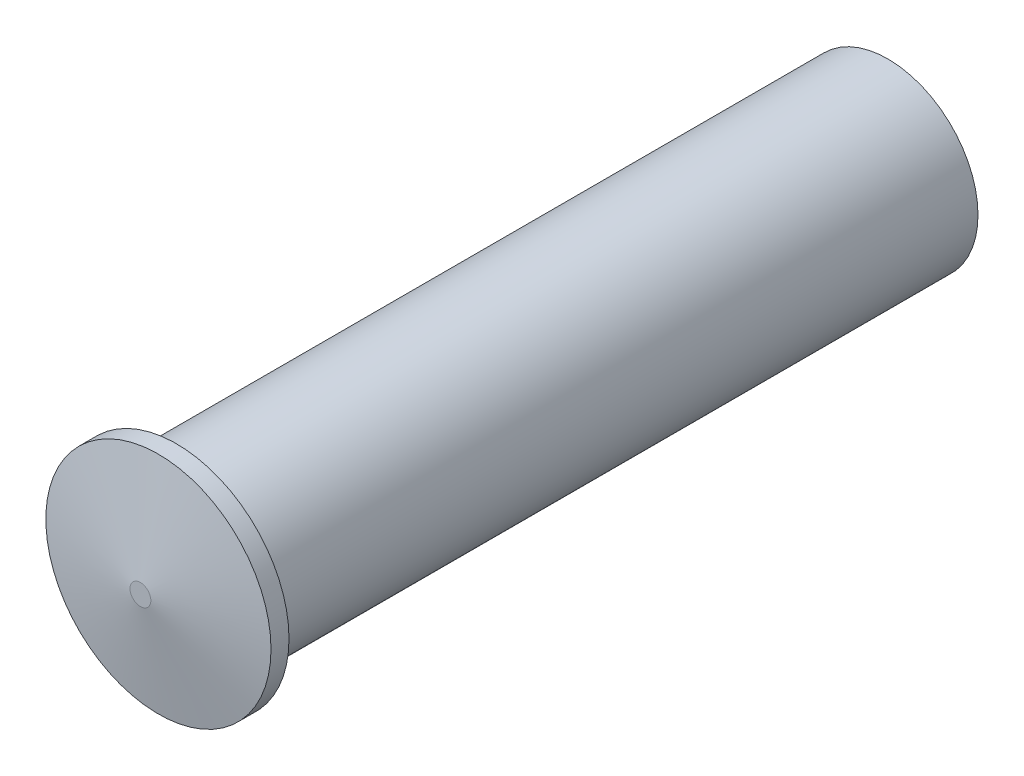
ISO-10303-21;
HEADER;
FILE_DESCRIPTION(('STEP AP214'),'2;1');
FILE_NAME('part.step','',(''),(''),'','','');
FILE_SCHEMA(('AUTOMOTIVE_DESIGN { 1 0 10303 214 1 1 1 1 }'));
ENDSEC;
DATA;
#1=APPLICATION_CONTEXT('core data for automotive mechanical design processes');
#2=APPLICATION_PROTOCOL_DEFINITION('international standard','automotive_design',2000,#1);
#3=PRODUCT_CONTEXT('',#1,'mechanical');
#4=PRODUCT('Part','Part','',(#3));
#5=PRODUCT_RELATED_PRODUCT_CATEGORY('part','',(#4));
#6=PRODUCT_DEFINITION_FORMATION('','',#4);
#7=PRODUCT_DEFINITION_CONTEXT('part definition',#1,'design');
#8=PRODUCT_DEFINITION('design','',#6,#7);
#9=PRODUCT_DEFINITION_SHAPE('','',#8);
#10=(LENGTH_UNIT() NAMED_UNIT(*) SI_UNIT(.MILLI.,.METRE.));
#11=(NAMED_UNIT(*) PLANE_ANGLE_UNIT() SI_UNIT($,.RADIAN.));
#12=(NAMED_UNIT(*) SI_UNIT($,.STERADIAN.) SOLID_ANGLE_UNIT());
#13=UNCERTAINTY_MEASURE_WITH_UNIT(LENGTH_MEASURE(1.E-05),#10,'distance_accuracy_value','');
#14=(GEOMETRIC_REPRESENTATION_CONTEXT(3) GLOBAL_UNCERTAINTY_ASSIGNED_CONTEXT((#13)) GLOBAL_UNIT_ASSIGNED_CONTEXT((#10,
#11,#12)) REPRESENTATION_CONTEXT('',''));
#15=CARTESIAN_POINT('',(0.,0.,0.));
#16=DIRECTION('',(0.,0.,1.));
#17=DIRECTION('',(1.,0.,0.));
#18=AXIS2_PLACEMENT_3D('',#15,#16,#17);
#19=CARTESIAN_POINT('',(0.,0.,-79.));
#20=DIRECTION('',(0.,0.,1.));
#21=DIRECTION('',(1.,0.,0.));
#22=AXIS2_PLACEMENT_3D('',#19,#20,#21);
#23=CYLINDRICAL_SURFACE('',#22,10.);
#24=CARTESIAN_POINT('',(0.,0.,-79.));
#25=DIRECTION('',(0.,0.,1.));
#26=DIRECTION('',(1.,0.,0.));
#27=AXIS2_PLACEMENT_3D('',#24,#25,#26);
#28=CIRCLE('',#27,10.);
#29=CARTESIAN_POINT('',(10.,0.,-79.));
#30=VERTEX_POINT('',#29);
#31=EDGE_CURVE('E10',#30,#30,#28,.T.);
#32=ORIENTED_EDGE('',*,*,#31,.T.);
#33=EDGE_LOOP('',(#32));
#34=FACE_BOUND('',#33,.T.);
#35=CARTESIAN_POINT('',(0.,0.,0.));
#36=DIRECTION('',(0.,0.,1.));
#37=DIRECTION('',(1.,0.,0.));
#38=AXIS2_PLACEMENT_3D('',#35,#36,#37);
#39=CIRCLE('',#38,10.);
#40=CARTESIAN_POINT('',(10.,0.,0.));
#41=VERTEX_POINT('',#40);
#42=EDGE_CURVE('E35',#41,#41,#39,.T.);
#43=ORIENTED_EDGE('',*,*,#42,.F.);
#44=EDGE_LOOP('',(#43));
#45=FACE_BOUND('',#44,.T.);
#46=ADVANCED_FACE('F32',(#34,#45),#23,.T.);
#47=CARTESIAN_POINT('',(0.,0.,-79.));
#48=DIRECTION('',(0.,0.,1.));
#49=DIRECTION('',(1.,0.,0.));
#50=AXIS2_PLACEMENT_3D('',#47,#48,#49);
#51=PLANE('',#50);
#52=CARTESIAN_POINT('',(0.,0.,-79.));
#53=DIRECTION('',(0.,0.,-1.));
#54=DIRECTION('',(-1.,0.,0.));
#55=AXIS2_PLACEMENT_3D('',#52,#53,#54);
#56=CIRCLE('',#55,8.);
#57=CARTESIAN_POINT('',(-8.,0.,-79.));
#58=VERTEX_POINT('',#57);
#59=EDGE_CURVE('E53',#58,#58,#56,.T.);
#60=ORIENTED_EDGE('',*,*,#59,.F.);
#61=EDGE_LOOP('',(#60));
#62=FACE_BOUND('',#61,.T.);
#63=ORIENTED_EDGE('',*,*,#31,.F.);
#64=EDGE_LOOP('',(#63));
#65=FACE_BOUND('',#64,.T.);
#66=ADVANCED_FACE('F68',(#62,#65),#51,.F.);
#67=CARTESIAN_POINT('',(0.,0.,2.));
#68=DIRECTION('',(0.,0.,-1.));
#69=DIRECTION('',(-1.,0.,0.));
#70=AXIS2_PLACEMENT_3D('',#67,#68,#69);
#71=CYLINDRICAL_SURFACE('',#70,12.5);
#72=CARTESIAN_POINT('',(0.,0.,2.));
#73=DIRECTION('',(0.,0.,1.));
#74=DIRECTION('',(1.,0.,0.));
#75=AXIS2_PLACEMENT_3D('',#72,#73,#74);
#76=CIRCLE('',#75,12.5);
#77=CARTESIAN_POINT('',(12.5,0.,2.));
#78=VERTEX_POINT('',#77);
#79=EDGE_CURVE('E42',#78,#78,#76,.T.);
#80=ORIENTED_EDGE('',*,*,#79,.F.);
#81=EDGE_LOOP('',(#80));
#82=FACE_BOUND('',#81,.T.);
#83=CARTESIAN_POINT('',(0.,0.,0.));
#84=DIRECTION('',(0.,0.,1.));
#85=DIRECTION('',(1.,0.,0.));
#86=AXIS2_PLACEMENT_3D('',#83,#84,#85);
#87=CIRCLE('',#86,12.5);
#88=CARTESIAN_POINT('',(12.5,0.,0.));
#89=VERTEX_POINT('',#88);
#90=EDGE_CURVE('E44',#89,#89,#87,.T.);
#91=ORIENTED_EDGE('',*,*,#90,.T.);
#92=EDGE_LOOP('',(#91));
#93=FACE_BOUND('',#92,.T.);
#94=ADVANCED_FACE('F71',(#82,#93),#71,.T.);
#95=CARTESIAN_POINT('',(0.,0.,0.));
#96=DIRECTION('',(0.,0.,1.));
#97=DIRECTION('',(1.,0.,0.));
#98=AXIS2_PLACEMENT_3D('',#95,#96,#97);
#99=PLANE('',#98);
#100=ORIENTED_EDGE('',*,*,#42,.T.);
#101=EDGE_LOOP('',(#100));
#102=FACE_BOUND('',#101,.T.);
#103=ORIENTED_EDGE('',*,*,#90,.F.);
#104=EDGE_LOOP('',(#103));
#105=FACE_BOUND('',#104,.T.);
#106=ADVANCED_FACE('F76',(#102,#105),#99,.F.);
#107=CARTESIAN_POINT('',(0.,0.,2.));
#108=DIRECTION('',(0.,0.,-1.));
#109=DIRECTION('',(1.,0.,0.));
#110=AXIS2_PLACEMENT_3D('',#107,#108,#109);
#111=CONICAL_SURFACE('',#110,12.5,1.39626340159547);
#112=CARTESIAN_POINT('',(0.,0.,4.));
#113=DIRECTION('',(0.,0.,1.));
#114=DIRECTION('',(1.,0.,0.));
#115=AXIS2_PLACEMENT_3D('',#112,#113,#114);
#116=CIRCLE('',#115,1.15743636076438);
#117=CARTESIAN_POINT('',(1.15743636076439,0.,4.));
#118=VERTEX_POINT('',#117);
#119=EDGE_CURVE('E47',#118,#118,#116,.T.);
#120=CARTESIAN_POINT('',(1.15743636076439,0.,4.));
#121=CARTESIAN_POINT('',(1.27558806533976,0.,3.97916666666667));
#122=CARTESIAN_POINT('',(1.39373976991513,0.,3.95833333333333));
#123=CARTESIAN_POINT('',(1.63004317906587,0.,3.91666666666667));
#124=CARTESIAN_POINT('',(1.74819488364124,0.,3.89583333333333));
#125=CARTESIAN_POINT('',(1.98449829279198,0.,3.85416666666667));
#126=CARTESIAN_POINT('',(2.10264999736735,0.,3.83333333333333));
#127=CARTESIAN_POINT('',(2.3389534065181,0.,3.79166666666667));
#128=CARTESIAN_POINT('',(2.45710511109347,0.,3.77083333333333));
#129=CARTESIAN_POINT('',(2.69340852024421,0.,3.72916666666667));
#130=CARTESIAN_POINT('',(2.81156022481958,0.,3.70833333333333));
#131=CARTESIAN_POINT('',(3.04786363397032,0.,3.66666666666667));
#132=CARTESIAN_POINT('',(3.16601533854569,0.,3.64583333333333));
#133=CARTESIAN_POINT('',(3.40231874769643,0.,3.60416666666667));
#134=CARTESIAN_POINT('',(3.52047045227181,0.,3.58333333333333));
#135=CARTESIAN_POINT('',(3.75677386142255,0.,3.54166666666667));
#136=CARTESIAN_POINT('',(3.87492556599792,0.,3.52083333333333));
#137=CARTESIAN_POINT('',(4.11122897514866,0.,3.47916666666667));
#138=CARTESIAN_POINT('',(4.22938067972403,0.,3.45833333333333));
#139=CARTESIAN_POINT('',(4.46568408887477,0.,3.41666666666667));
#140=CARTESIAN_POINT('',(4.58383579345014,0.,3.39583333333333));
#141=CARTESIAN_POINT('',(4.82013920260089,0.,3.35416666666667));
#142=CARTESIAN_POINT('',(4.93829090717626,0.,3.33333333333333));
#143=CARTESIAN_POINT('',(5.174594316327,0.,3.29166666666667));
#144=CARTESIAN_POINT('',(5.29274602090237,0.,3.27083333333333));
#145=CARTESIAN_POINT('',(5.52904943005311,0.,3.22916666666667));
#146=CARTESIAN_POINT('',(5.64720113462848,0.,3.20833333333333));
#147=CARTESIAN_POINT('',(5.88350454377923,0.,3.16666666666667));
#148=CARTESIAN_POINT('',(6.0016562483546,0.,3.14583333333333));
#149=CARTESIAN_POINT('',(6.23795965750534,0.,3.10416666666667));
#150=CARTESIAN_POINT('',(6.35611136208071,0.,3.08333333333333));
#151=CARTESIAN_POINT('',(6.59241477123145,0.,3.04166666666667));
#152=CARTESIAN_POINT('',(6.71056647580682,0.,3.02083333333333));
#153=CARTESIAN_POINT('',(6.94686988495756,0.,2.97916666666667));
#154=CARTESIAN_POINT('',(7.06502158953294,0.,2.95833333333333));
#155=CARTESIAN_POINT('',(7.30132499868368,0.,2.91666666666667));
#156=CARTESIAN_POINT('',(7.41947670325905,0.,2.89583333333333));
#157=CARTESIAN_POINT('',(7.65578011240979,0.,2.85416666666667));
#158=CARTESIAN_POINT('',(7.77393181698516,0.,2.83333333333333));
#159=CARTESIAN_POINT('',(8.0102352261359,0.,2.79166666666667));
#160=CARTESIAN_POINT('',(8.12838693071127,0.,2.77083333333333));
#161=CARTESIAN_POINT('',(8.36469033986202,0.,2.72916666666667));
#162=CARTESIAN_POINT('',(8.48284204443739,0.,2.70833333333333));
#163=CARTESIAN_POINT('',(8.71914545358813,0.,2.66666666666667));
#164=CARTESIAN_POINT('',(8.8372971581635,0.,2.64583333333333));
#165=CARTESIAN_POINT('',(9.07360056731424,0.,2.60416666666667));
#166=CARTESIAN_POINT('',(9.19175227188961,0.,2.58333333333333));
#167=CARTESIAN_POINT('',(9.42805568104035,0.,2.54166666666667));
#168=CARTESIAN_POINT('',(9.54620738561573,0.,2.52083333333333));
#169=CARTESIAN_POINT('',(9.78251079476647,0.,2.47916666666667));
#170=CARTESIAN_POINT('',(9.90066249934184,0.,2.45833333333333));
#171=CARTESIAN_POINT('',(10.1369659084926,0.,2.41666666666667));
#172=CARTESIAN_POINT('',(10.255117613068,0.,2.39583333333333));
#173=CARTESIAN_POINT('',(10.4914210222187,0.,2.35416666666667));
#174=CARTESIAN_POINT('',(10.6095727267941,0.,2.33333333333333));
#175=CARTESIAN_POINT('',(10.8458761359448,0.,2.29166666666667));
#176=CARTESIAN_POINT('',(10.9640278405202,0.,2.27083333333333));
#177=CARTESIAN_POINT('',(11.2003312496709,0.,2.22916666666667));
#178=CARTESIAN_POINT('',(11.3184829542463,0.,2.20833333333333));
#179=CARTESIAN_POINT('',(11.554786363397,0.,2.16666666666667));
#180=CARTESIAN_POINT('',(11.6729380679724,0.,2.14583333333333));
#181=CARTESIAN_POINT('',(11.9092414771231,0.,2.10416666666667));
#182=CARTESIAN_POINT('',(12.0273931816985,0.,2.08333333333333));
#183=CARTESIAN_POINT('',(12.2636965908493,0.,2.04166666666667));
#184=CARTESIAN_POINT('',(12.3818482954246,0.,2.02083333333333));
#185=CARTESIAN_POINT('',(12.5,0.,2.));
#186=B_SPLINE_CURVE_WITH_KNOTS('',3,(#120,#121,#122,#123,#124,#125,#126,#127,#128,#129,#130,
#131,#132,#133,#134,#135,#136,#137,#138,#139,#140,#141,#142,#143,#144,#145,#146,#147,#148,#149,
#150,#151,#152,#153,#154,#155,#156,#157,#158,#159,#160,#161,#162,#163,#164,#165,#166,#167,#168,
#169,#170,#171,#172,#173,#174,#175,#176,#177,#178,#179,#180,#181,#182,#183,#184,#185),
.UNSPECIFIED.,.F.,.F.,(4,2,2,2,2,2,2,2,2,2,2,2,2,2,2,2,2,2,2,2,2,2,2,2,2,2,2,2,2,2,2,2,4),(0.,
0.359923155196484,0.719846310392966,1.07976946558945,1.43969262078593,1.79961577598242,
2.1595389311789,2.51946208637538,2.87938524157187,3.23930839676835,3.59923155196483,
3.95915470716131,4.3190778623578,4.67900101755428,5.03892417275076,5.39884732794725,
5.75877048314373,6.11869363834021,6.4786167935367,6.83853994873318,7.19846310392966,
7.55838625912615,7.91830941432263,8.27823256951911,8.6381557247156,8.99807887991208,
9.35800203510856,9.71792519030505,10.0778483455015,10.437771500698,10.7976946558945,
11.157617811091,11.5175409662875),.UNSPECIFIED.);
#187=EDGE_CURVE('BSEAM82',#118,#78,#186,.T.);
#188=ORIENTED_EDGE('',*,*,#119,.F.);
#189=ORIENTED_EDGE('',*,*,#79,.T.);
#190=ORIENTED_EDGE('',*,*,#187,.T.);
#191=ORIENTED_EDGE('',*,*,#187,.F.);
#192=EDGE_LOOP('',(#188,#190,#189,#191));
#193=FACE_BOUND('',#192,.T.);
#194=ADVANCED_FACE('F82',(#193),#111,.T.);
#195=CARTESIAN_POINT('',(0.,0.,4.));
#196=DIRECTION('',(0.,0.,1.));
#197=DIRECTION('',(1.,0.,0.));
#198=AXIS2_PLACEMENT_3D('',#195,#196,#197);
#199=PLANE('',#198);
#200=ORIENTED_EDGE('',*,*,#119,.T.);
#201=EDGE_LOOP('',(#200));
#202=FACE_BOUND('',#201,.T.);
#203=ADVANCED_FACE('F64',(#202),#199,.T.);
#204=CARTESIAN_POINT('',(0.,0.,0.));
#205=DIRECTION('',(0.,0.,-1.));
#206=DIRECTION('',(-1.,0.,0.));
#207=AXIS2_PLACEMENT_3D('',#204,#205,#206);
#208=CYLINDRICAL_SURFACE('',#207,8.);
#209=CARTESIAN_POINT('',(0.,0.,0.));
#210=DIRECTION('',(0.,0.,-1.));
#211=DIRECTION('',(-1.,0.,0.));
#212=AXIS2_PLACEMENT_3D('',#209,#210,#211);
#213=CIRCLE('',#212,8.);
#214=CARTESIAN_POINT('',(-8.,0.,0.));
#215=VERTEX_POINT('',#214);
#216=EDGE_CURVE('E52',#215,#215,#213,.T.);
#217=ORIENTED_EDGE('',*,*,#216,.F.);
#218=EDGE_LOOP('',(#217));
#219=FACE_BOUND('',#218,.T.);
#220=ORIENTED_EDGE('',*,*,#59,.T.);
#221=EDGE_LOOP('',(#220));
#222=FACE_BOUND('',#221,.T.);
#223=ADVANCED_FACE('F61',(#219,#222),#208,.F.);
#224=CARTESIAN_POINT('',(0.,0.,0.));
#225=DIRECTION('',(0.,0.,-1.));
#226=DIRECTION('',(-1.,0.,0.));
#227=AXIS2_PLACEMENT_3D('',#224,#225,#226);
#228=PLANE('',#227);
#229=ORIENTED_EDGE('',*,*,#216,.T.);
#230=EDGE_LOOP('',(#229));
#231=FACE_BOUND('',#230,.T.);
#232=ADVANCED_FACE('F59',(#231),#228,.T.);
#233=CLOSED_SHELL('',(#46,#66,#94,#106,#194,#203,#223,#232));
#234=MANIFOLD_SOLID_BREP('B2',#233);
#235=ADVANCED_BREP_SHAPE_REPRESENTATION('',(#18,#234),#14);
#236=SHAPE_DEFINITION_REPRESENTATION(#9,#235);
ENDSEC;
END-ISO-10303-21;
